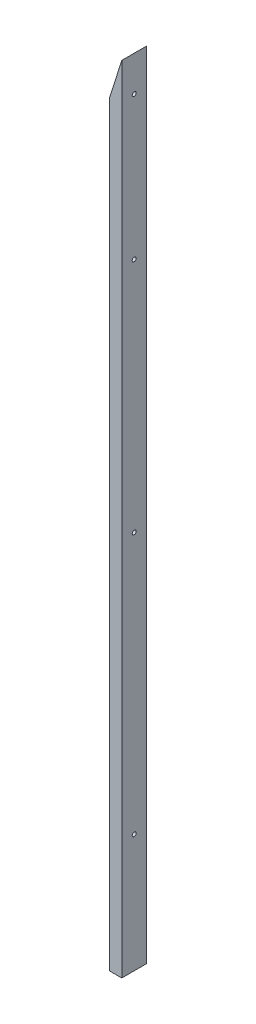
ISO-10303-21;
HEADER;
FILE_DESCRIPTION(('STEP AP214'),'2;1');
FILE_NAME('part.step','',(''),(''),'','','');
FILE_SCHEMA(('AUTOMOTIVE_DESIGN { 1 0 10303 214 1 1 1 1 }'));
ENDSEC;
DATA;
#1=APPLICATION_CONTEXT('core data for automotive mechanical design processes');
#2=APPLICATION_PROTOCOL_DEFINITION('international standard','automotive_design',2000,#1);
#3=PRODUCT_CONTEXT('',#1,'mechanical');
#4=PRODUCT('Part','Part','',(#3));
#5=PRODUCT_RELATED_PRODUCT_CATEGORY('part','',(#4));
#6=PRODUCT_DEFINITION_FORMATION('','',#4);
#7=PRODUCT_DEFINITION_CONTEXT('part definition',#1,'design');
#8=PRODUCT_DEFINITION('design','',#6,#7);
#9=PRODUCT_DEFINITION_SHAPE('','',#8);
#10=(LENGTH_UNIT() NAMED_UNIT(*) SI_UNIT(.MILLI.,.METRE.));
#11=(NAMED_UNIT(*) PLANE_ANGLE_UNIT() SI_UNIT($,.RADIAN.));
#12=(NAMED_UNIT(*) SI_UNIT($,.STERADIAN.) SOLID_ANGLE_UNIT());
#13=UNCERTAINTY_MEASURE_WITH_UNIT(LENGTH_MEASURE(1.E-05),#10,'distance_accuracy_value','');
#14=(GEOMETRIC_REPRESENTATION_CONTEXT(3) GLOBAL_UNCERTAINTY_ASSIGNED_CONTEXT((#13)) GLOBAL_UNIT_ASSIGNED_CONTEXT((#10,
#11,#12)) REPRESENTATION_CONTEXT('',''));
#15=CARTESIAN_POINT('',(0.,0.,0.));
#16=DIRECTION('',(0.,0.,1.));
#17=DIRECTION('',(1.,0.,0.));
#18=AXIS2_PLACEMENT_3D('',#15,#16,#17);
#19=CARTESIAN_POINT('',(-12.5,1600.,-25.));
#20=DIRECTION('',(1.,0.,0.));
#21=DIRECTION('',(0.,0.,-1.));
#22=AXIS2_PLACEMENT_3D('',#19,#20,#21);
#23=PLANE('',#22);
#24=CARTESIAN_POINT('',(-12.5,237.5,0.));
#25=DIRECTION('',(1.,0.,0.));
#26=DIRECTION('',(0.,0.,-1.));
#27=AXIS2_PLACEMENT_3D('',#24,#25,#26);
#28=CIRCLE('',#27,4.);
#29=CARTESIAN_POINT('',(-12.5,237.5,-4.));
#30=VERTEX_POINT('',#29);
#31=EDGE_CURVE('E103',#30,#30,#28,.T.);
#32=ORIENTED_EDGE('',*,*,#31,.T.);
#33=EDGE_LOOP('',(#32));
#34=FACE_BOUND('',#33,.T.);
#35=CARTESIAN_POINT('',(-12.5,762.5,0.));
#36=DIRECTION('',(1.,0.,0.));
#37=DIRECTION('',(0.,0.,-1.));
#38=AXIS2_PLACEMENT_3D('',#35,#36,#37);
#39=CIRCLE('',#38,4.);
#40=CARTESIAN_POINT('',(-12.5,762.5,-4.));
#41=VERTEX_POINT('',#40);
#42=EDGE_CURVE('E110',#41,#41,#39,.T.);
#43=ORIENTED_EDGE('',*,*,#42,.T.);
#44=EDGE_LOOP('',(#43));
#45=FACE_BOUND('',#44,.T.);
#46=CARTESIAN_POINT('',(-12.5,1237.5,0.));
#47=DIRECTION('',(1.,0.,0.));
#48=DIRECTION('',(0.,0.,-1.));
#49=AXIS2_PLACEMENT_3D('',#46,#47,#48);
#50=CIRCLE('',#49,4.);
#51=CARTESIAN_POINT('',(-12.5,1237.5,-4.));
#52=VERTEX_POINT('',#51);
#53=EDGE_CURVE('E148',#52,#52,#50,.T.);
#54=ORIENTED_EDGE('',*,*,#53,.T.);
#55=EDGE_LOOP('',(#54));
#56=FACE_BOUND('',#55,.T.);
#57=DIRECTION('',(0.,-1.,0.));
#58=VECTOR('',#57,1.);
#59=CARTESIAN_POINT('',(-12.5,1600.,25.));
#60=LINE('',#59,#58);
#61=CARTESIAN_POINT('',(-12.5,1517.37698565,25.));
#62=VERTEX_POINT('',#61);
#63=CARTESIAN_POINT('',(-12.5,0.,25.));
#64=VERTEX_POINT('',#63);
#65=EDGE_CURVE('E11',#62,#64,#60,.T.);
#66=ORIENTED_EDGE('',*,*,#65,.F.);
#67=DIRECTION('',(0.,0.,1.));
#68=VECTOR('',#67,1.);
#69=CARTESIAN_POINT('',(-12.5,1517.37698565,-35.));
#70=LINE('',#69,#68);
#71=CARTESIAN_POINT('',(-12.5,1517.37698565,-25.));
#72=VERTEX_POINT('',#71);
#73=EDGE_CURVE('E82',#72,#62,#70,.T.);
#74=ORIENTED_EDGE('',*,*,#73,.F.);
#75=DIRECTION('',(0.,-1.,0.));
#76=VECTOR('',#75,1.);
#77=CARTESIAN_POINT('',(-12.5,1600.,-25.));
#78=LINE('',#77,#76);
#79=CARTESIAN_POINT('',(-12.5,0.,-25.));
#80=VERTEX_POINT('',#79);
#81=EDGE_CURVE('E66',#72,#80,#78,.T.);
#82=ORIENTED_EDGE('',*,*,#81,.T.);
#83=DIRECTION('',(0.,0.,1.));
#84=VECTOR('',#83,1.);
#85=CARTESIAN_POINT('',(-12.5,0.,-25.));
#86=LINE('',#85,#84);
#87=EDGE_CURVE('E98',#80,#64,#86,.T.);
#88=ORIENTED_EDGE('',*,*,#87,.T.);
#89=EDGE_LOOP('',(#66,#74,#82,#88));
#90=FACE_BOUND('',#89,.T.);
#91=ADVANCED_FACE('F42',(#34,#45,#56,#90),#23,.F.);
#92=CARTESIAN_POINT('',(12.5,1600.,25.));
#93=DIRECTION('',(0.,0.,-1.));
#94=DIRECTION('',(-1.,0.,0.));
#95=AXIS2_PLACEMENT_3D('',#92,#93,#94);
#96=PLANE('',#95);
#97=DIRECTION('',(0.,-1.,0.));
#98=VECTOR('',#97,1.);
#99=CARTESIAN_POINT('',(12.5,1600.,25.));
#100=LINE('',#99,#98);
#101=CARTESIAN_POINT('',(12.5,1596.12698565,25.));
#102=VERTEX_POINT('',#101);
#103=CARTESIAN_POINT('',(12.5,0.,25.));
#104=VERTEX_POINT('',#103);
#105=EDGE_CURVE('E51',#102,#104,#100,.T.);
#106=ORIENTED_EDGE('',*,*,#105,.F.);
#107=DIRECTION('',(0.302579132426839,0.953124267144542,0.));
#108=VECTOR('',#107,1.);
#109=CARTESIAN_POINT('',(12.5,1596.12698565,25.));
#110=LINE('',#109,#108);
#111=EDGE_CURVE('E85',#62,#102,#110,.T.);
#112=ORIENTED_EDGE('',*,*,#111,.F.);
#113=ORIENTED_EDGE('',*,*,#65,.T.);
#114=DIRECTION('',(1.,0.,0.));
#115=VECTOR('',#114,1.);
#116=CARTESIAN_POINT('',(12.5,0.,25.));
#117=LINE('',#116,#115);
#118=EDGE_CURVE('E102',#64,#104,#117,.T.);
#119=ORIENTED_EDGE('',*,*,#118,.T.);
#120=EDGE_LOOP('',(#106,#112,#113,#119));
#121=FACE_BOUND('',#120,.T.);
#122=ADVANCED_FACE('F92',(#121),#96,.F.);
#123=CARTESIAN_POINT('',(12.5,1600.,-25.));
#124=DIRECTION('',(-1.,0.,0.));
#125=DIRECTION('',(0.,0.,1.));
#126=AXIS2_PLACEMENT_3D('',#123,#124,#125);
#127=PLANE('',#126);
#128=CARTESIAN_POINT('',(12.5,237.5,0.));
#129=DIRECTION('',(1.,0.,0.));
#130=DIRECTION('',(0.,0.,-1.));
#131=AXIS2_PLACEMENT_3D('',#128,#129,#130);
#132=CIRCLE('',#131,4.);
#133=CARTESIAN_POINT('',(12.5,237.5,-4.));
#134=VERTEX_POINT('',#133);
#135=EDGE_CURVE('E144',#134,#134,#132,.T.);
#136=ORIENTED_EDGE('',*,*,#135,.F.);
#137=EDGE_LOOP('',(#136));
#138=FACE_BOUND('',#137,.T.);
#139=CARTESIAN_POINT('',(12.5,762.5,0.));
#140=DIRECTION('',(1.,0.,0.));
#141=DIRECTION('',(0.,0.,-1.));
#142=AXIS2_PLACEMENT_3D('',#139,#140,#141);
#143=CIRCLE('',#142,4.);
#144=CARTESIAN_POINT('',(12.5,762.5,-4.));
#145=VERTEX_POINT('',#144);
#146=EDGE_CURVE('E149',#145,#145,#143,.T.);
#147=ORIENTED_EDGE('',*,*,#146,.F.);
#148=EDGE_LOOP('',(#147));
#149=FACE_BOUND('',#148,.T.);
#150=CARTESIAN_POINT('',(12.5,1237.5,0.));
#151=DIRECTION('',(1.,0.,0.));
#152=DIRECTION('',(0.,0.,-1.));
#153=AXIS2_PLACEMENT_3D('',#150,#151,#152);
#154=CIRCLE('',#153,4.);
#155=CARTESIAN_POINT('',(12.5,1237.5,-4.));
#156=VERTEX_POINT('',#155);
#157=EDGE_CURVE('E139',#156,#156,#154,.T.);
#158=ORIENTED_EDGE('',*,*,#157,.F.);
#159=EDGE_LOOP('',(#158));
#160=FACE_BOUND('',#159,.T.);
#161=CARTESIAN_POINT('',(12.5,1525.,0.));
#162=DIRECTION('',(1.,0.,0.));
#163=DIRECTION('',(0.,0.,-1.));
#164=AXIS2_PLACEMENT_3D('',#161,#162,#163);
#165=CIRCLE('',#164,4.);
#166=CARTESIAN_POINT('',(12.5,1525.,-4.));
#167=VERTEX_POINT('',#166);
#168=EDGE_CURVE('E134',#167,#167,#165,.T.);
#169=ORIENTED_EDGE('',*,*,#168,.F.);
#170=EDGE_LOOP('',(#169));
#171=FACE_BOUND('',#170,.T.);
#172=DIRECTION('',(0.,-1.,0.));
#173=VECTOR('',#172,1.);
#174=CARTESIAN_POINT('',(12.5,1600.,-25.));
#175=LINE('',#174,#173);
#176=CARTESIAN_POINT('',(12.5,1596.12698565,-25.));
#177=VERTEX_POINT('',#176);
#178=CARTESIAN_POINT('',(12.5,0.,-25.));
#179=VERTEX_POINT('',#178);
#180=EDGE_CURVE('E122',#177,#179,#175,.T.);
#181=ORIENTED_EDGE('',*,*,#180,.F.);
#182=DIRECTION('',(0.,0.,1.));
#183=VECTOR('',#182,1.);
#184=CARTESIAN_POINT('',(12.5,1596.12698565,-35.));
#185=LINE('',#184,#183);
#186=EDGE_CURVE('E58',#177,#102,#185,.T.);
#187=ORIENTED_EDGE('',*,*,#186,.T.);
#188=ORIENTED_EDGE('',*,*,#105,.T.);
#189=DIRECTION('',(0.,0.,-1.));
#190=VECTOR('',#189,1.);
#191=CARTESIAN_POINT('',(12.5,0.,-25.));
#192=LINE('',#191,#190);
#193=EDGE_CURVE('E107',#104,#179,#192,.T.);
#194=ORIENTED_EDGE('',*,*,#193,.T.);
#195=EDGE_LOOP('',(#181,#187,#188,#194));
#196=FACE_BOUND('',#195,.T.);
#197=ADVANCED_FACE('F128',(#138,#149,#160,#171,#196),#127,.F.);
#198=CARTESIAN_POINT('',(12.5,1600.,-25.));
#199=DIRECTION('',(0.,0.,1.));
#200=DIRECTION('',(1.,0.,0.));
#201=AXIS2_PLACEMENT_3D('',#198,#199,#200);
#202=PLANE('',#201);
#203=ORIENTED_EDGE('',*,*,#81,.F.);
#204=DIRECTION('',(0.302579132426839,0.953124267144543,0.));
#205=VECTOR('',#204,1.);
#206=CARTESIAN_POINT('',(13.6169599636073,1599.64540953536,-25.));
#207=LINE('',#206,#205);
#208=EDGE_CURVE('E86',#72,#177,#207,.T.);
#209=ORIENTED_EDGE('',*,*,#208,.T.);
#210=ORIENTED_EDGE('',*,*,#180,.T.);
#211=DIRECTION('',(-1.,0.,0.));
#212=VECTOR('',#211,1.);
#213=CARTESIAN_POINT('',(12.5,0.,-25.));
#214=LINE('',#213,#212);
#215=EDGE_CURVE('E117',#179,#80,#214,.T.);
#216=ORIENTED_EDGE('',*,*,#215,.T.);
#217=EDGE_LOOP('',(#203,#209,#210,#216));
#218=FACE_BOUND('',#217,.T.);
#219=ADVANCED_FACE('F132',(#218),#202,.F.);
#220=CARTESIAN_POINT('',(0.,0.,0.));
#221=DIRECTION('',(0.,-1.,0.));
#222=DIRECTION('',(0.,0.,-1.));
#223=AXIS2_PLACEMENT_3D('',#220,#221,#222);
#224=PLANE('',#223);
#225=ORIENTED_EDGE('',*,*,#87,.F.);
#226=ORIENTED_EDGE('',*,*,#215,.F.);
#227=ORIENTED_EDGE('',*,*,#193,.F.);
#228=ORIENTED_EDGE('',*,*,#118,.F.);
#229=EDGE_LOOP('',(#225,#226,#227,#228));
#230=FACE_BOUND('',#229,.T.);
#231=ADVANCED_FACE('F130',(#230),#224,.T.);
#232=CARTESIAN_POINT('',(-537.5,1525.,0.));
#233=DIRECTION('',(1.,0.,0.));
#234=DIRECTION('',(0.,0.,-1.));
#235=AXIS2_PLACEMENT_3D('',#232,#233,#234);
#236=CYLINDRICAL_SURFACE('',#235,4.);
#237=CARTESIAN_POINT('',(-10.0799954444446,1525.,0.));
#238=DIRECTION('',(0.953124267144542,-0.302579132426839,0.));
#239=DIRECTION('',(0.302579132426839,0.953124267144543,0.));
#240=AXIS2_PLACEMENT_3D('',#237,#238,#239);
#241=ELLIPSE('',#240,4.19672453832654,4.);
#242=CARTESIAN_POINT('',(-8.81015417460333,1529.,0.));
#243=VERTEX_POINT('',#242);
#244=EDGE_CURVE('E45',#243,#243,#241,.F.);
#245=ORIENTED_EDGE('',*,*,#244,.T.);
#246=EDGE_LOOP('',(#245));
#247=FACE_BOUND('',#246,.T.);
#248=ORIENTED_EDGE('',*,*,#168,.T.);
#249=EDGE_LOOP('',(#248));
#250=FACE_BOUND('',#249,.T.);
#251=ADVANCED_FACE('F176',(#247,#250),#236,.F.);
#252=CARTESIAN_POINT('',(-537.5,1237.5,0.));
#253=DIRECTION('',(1.,0.,0.));
#254=DIRECTION('',(0.,0.,-1.));
#255=AXIS2_PLACEMENT_3D('',#252,#253,#254);
#256=CYLINDRICAL_SURFACE('',#255,4.);
#257=ORIENTED_EDGE('',*,*,#157,.T.);
#258=EDGE_LOOP('',(#257));
#259=FACE_BOUND('',#258,.T.);
#260=ORIENTED_EDGE('',*,*,#53,.F.);
#261=EDGE_LOOP('',(#260));
#262=FACE_BOUND('',#261,.T.);
#263=ADVANCED_FACE('F167',(#259,#262),#256,.F.);
#264=CARTESIAN_POINT('',(-537.5,762.5,0.));
#265=DIRECTION('',(1.,0.,0.));
#266=DIRECTION('',(0.,0.,-1.));
#267=AXIS2_PLACEMENT_3D('',#264,#265,#266);
#268=CYLINDRICAL_SURFACE('',#267,4.);
#269=ORIENTED_EDGE('',*,*,#146,.T.);
#270=EDGE_LOOP('',(#269));
#271=FACE_BOUND('',#270,.T.);
#272=ORIENTED_EDGE('',*,*,#42,.F.);
#273=EDGE_LOOP('',(#272));
#274=FACE_BOUND('',#273,.T.);
#275=ADVANCED_FACE('F164',(#271,#274),#268,.F.);
#276=CARTESIAN_POINT('',(-537.5,237.5,0.));
#277=DIRECTION('',(1.,0.,0.));
#278=DIRECTION('',(0.,0.,-1.));
#279=AXIS2_PLACEMENT_3D('',#276,#277,#278);
#280=CYLINDRICAL_SURFACE('',#279,4.);
#281=ORIENTED_EDGE('',*,*,#135,.T.);
#282=EDGE_LOOP('',(#281));
#283=FACE_BOUND('',#282,.T.);
#284=ORIENTED_EDGE('',*,*,#31,.F.);
#285=EDGE_LOOP('',(#284));
#286=FACE_BOUND('',#285,.T.);
#287=ADVANCED_FACE('F166',(#283,#286),#280,.F.);
#288=CARTESIAN_POINT('',(12.5,1596.12698565,-35.));
#289=DIRECTION('',(0.953124267144542,-0.302579132426839,0.));
#290=DIRECTION('',(0.302579132426839,0.953124267144543,0.));
#291=AXIS2_PLACEMENT_3D('',#288,#289,#290);
#292=PLANE('',#291);
#293=ORIENTED_EDGE('',*,*,#244,.F.);
#294=EDGE_LOOP('',(#293));
#295=FACE_BOUND('',#294,.T.);
#296=ORIENTED_EDGE('',*,*,#73,.T.);
#297=ORIENTED_EDGE('',*,*,#111,.T.);
#298=ORIENTED_EDGE('',*,*,#186,.F.);
#299=ORIENTED_EDGE('',*,*,#208,.F.);
#300=EDGE_LOOP('',(#296,#297,#298,#299));
#301=FACE_BOUND('',#300,.T.);
#302=ADVANCED_FACE('F84',(#295,#301),#292,.F.);
#303=CLOSED_SHELL('',(#91,#122,#197,#219,#231,#251,#263,#275,#287,#302));
#304=MANIFOLD_SOLID_BREP('B2',#303);
#305=ADVANCED_BREP_SHAPE_REPRESENTATION('',(#18,#304),#14);
#306=SHAPE_DEFINITION_REPRESENTATION(#9,#305);
ENDSEC;
END-ISO-10303-21;
